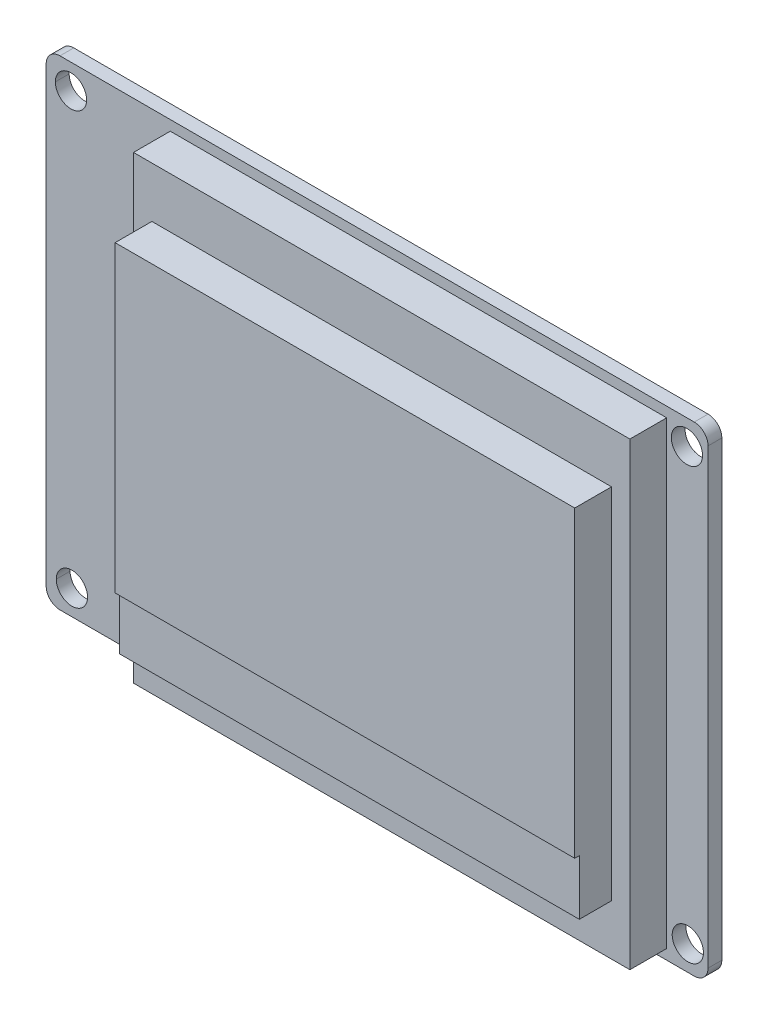
ISO-10303-21;
HEADER;
FILE_DESCRIPTION(('STEP AP214'),'2;1');
FILE_NAME('part.step','',(''),(''),'','','');
FILE_SCHEMA(('AUTOMOTIVE_DESIGN { 1 0 10303 214 1 1 1 1 }'));
ENDSEC;
DATA;
#1=APPLICATION_CONTEXT('core data for automotive mechanical design processes');
#2=APPLICATION_PROTOCOL_DEFINITION('international standard','automotive_design',2000,#1);
#3=PRODUCT_CONTEXT('',#1,'mechanical');
#4=PRODUCT('Part','Part','',(#3));
#5=PRODUCT_RELATED_PRODUCT_CATEGORY('part','',(#4));
#6=PRODUCT_DEFINITION_FORMATION('','',#4);
#7=PRODUCT_DEFINITION_CONTEXT('part definition',#1,'design');
#8=PRODUCT_DEFINITION('design','',#6,#7);
#9=PRODUCT_DEFINITION_SHAPE('','',#8);
#10=(LENGTH_UNIT() NAMED_UNIT(*) SI_UNIT(.MILLI.,.METRE.));
#11=(NAMED_UNIT(*) PLANE_ANGLE_UNIT() SI_UNIT($,.RADIAN.));
#12=(NAMED_UNIT(*) SI_UNIT($,.STERADIAN.) SOLID_ANGLE_UNIT());
#13=UNCERTAINTY_MEASURE_WITH_UNIT(LENGTH_MEASURE(1.E-05),#10,'distance_accuracy_value','');
#14=(GEOMETRIC_REPRESENTATION_CONTEXT(3) GLOBAL_UNCERTAINTY_ASSIGNED_CONTEXT((#13)) GLOBAL_UNIT_ASSIGNED_CONTEXT((#10,
#11,#12)) REPRESENTATION_CONTEXT('',''));
#15=CARTESIAN_POINT('',(0.,0.,0.));
#16=DIRECTION('',(0.,0.,1.));
#17=DIRECTION('',(1.,0.,0.));
#18=AXIS2_PLACEMENT_3D('',#15,#16,#17);
#19=CARTESIAN_POINT('',(-38.1,-23.4,1.5));
#20=DIRECTION('',(0.,0.,-1.));
#21=DIRECTION('',(-1.,0.,0.));
#22=AXIS2_PLACEMENT_3D('',#19,#20,#21);
#23=CYLINDRICAL_SURFACE('',#22,1.7);
#24=CARTESIAN_POINT('',(-38.1,-23.4,1.5));
#25=DIRECTION('',(0.,0.,1.));
#26=DIRECTION('',(1.,0.,0.));
#27=AXIS2_PLACEMENT_3D('',#24,#25,#26);
#28=CIRCLE('',#27,1.7);
#29=CARTESIAN_POINT('',(-39.8,-23.4,1.5));
#30=VERTEX_POINT('',#29);
#31=CARTESIAN_POINT('',(-36.4,-23.4,1.5));
#32=VERTEX_POINT('',#31);
#33=EDGE_CURVE('E280',#30,#32,#28,.T.);
#34=ORIENTED_EDGE('',*,*,#33,.T.);
#35=DIRECTION('',(0.,0.,-1.));
#36=VECTOR('',#35,1.);
#37=CARTESIAN_POINT('',(-36.4,-23.4,1.5));
#38=LINE('',#37,#36);
#39=CARTESIAN_POINT('',(-36.4,-23.4,0.));
#40=VERTEX_POINT('',#39);
#41=EDGE_CURVE('E243',#32,#40,#38,.T.);
#42=ORIENTED_EDGE('',*,*,#41,.T.);
#43=CARTESIAN_POINT('',(-38.1,-23.4,0.));
#44=DIRECTION('',(0.,0.,1.));
#45=DIRECTION('',(1.,0.,0.));
#46=AXIS2_PLACEMENT_3D('',#43,#44,#45);
#47=CIRCLE('',#46,1.7);
#48=CARTESIAN_POINT('',(-39.8,-23.4,0.));
#49=VERTEX_POINT('',#48);
#50=EDGE_CURVE('E242',#49,#40,#47,.T.);
#51=ORIENTED_EDGE('',*,*,#50,.F.);
#52=DIRECTION('',(0.,0.,-1.));
#53=VECTOR('',#52,1.);
#54=CARTESIAN_POINT('',(-39.8,-23.4,1.5));
#55=LINE('',#54,#53);
#56=EDGE_CURVE('E228',#30,#49,#55,.T.);
#57=ORIENTED_EDGE('',*,*,#56,.F.);
#58=EDGE_LOOP('',(#34,#42,#51,#57));
#59=FACE_BOUND('',#58,.T.);
#60=ADVANCED_FACE('F48',(#59),#23,.F.);
#61=CARTESIAN_POINT('',(-38.2,23.4,1.5));
#62=DIRECTION('',(0.,0.,-1.));
#63=DIRECTION('',(-1.,0.,0.));
#64=AXIS2_PLACEMENT_3D('',#61,#62,#63);
#65=CYLINDRICAL_SURFACE('',#64,1.7);
#66=CARTESIAN_POINT('',(-38.2,23.4,1.5));
#67=DIRECTION('',(0.,0.,1.));
#68=DIRECTION('',(1.,0.,0.));
#69=AXIS2_PLACEMENT_3D('',#66,#67,#68);
#70=CIRCLE('',#69,1.7);
#71=CARTESIAN_POINT('',(-39.9,23.4,1.5));
#72=VERTEX_POINT('',#71);
#73=CARTESIAN_POINT('',(-36.5,23.4,1.5));
#74=VERTEX_POINT('',#73);
#75=EDGE_CURVE('E364',#72,#74,#70,.T.);
#76=ORIENTED_EDGE('',*,*,#75,.T.);
#77=DIRECTION('',(0.,0.,-1.));
#78=VECTOR('',#77,1.);
#79=CARTESIAN_POINT('',(-36.5,23.4,1.5));
#80=LINE('',#79,#78);
#81=CARTESIAN_POINT('',(-36.5,23.4,0.));
#82=VERTEX_POINT('',#81);
#83=EDGE_CURVE('E361',#74,#82,#80,.T.);
#84=ORIENTED_EDGE('',*,*,#83,.T.);
#85=CARTESIAN_POINT('',(-38.2,23.4,0.));
#86=DIRECTION('',(0.,0.,1.));
#87=DIRECTION('',(1.,0.,0.));
#88=AXIS2_PLACEMENT_3D('',#85,#86,#87);
#89=CIRCLE('',#88,1.7);
#90=CARTESIAN_POINT('',(-39.9,23.4,0.));
#91=VERTEX_POINT('',#90);
#92=EDGE_CURVE('E251',#91,#82,#89,.T.);
#93=ORIENTED_EDGE('',*,*,#92,.F.);
#94=DIRECTION('',(0.,0.,-1.));
#95=VECTOR('',#94,1.);
#96=CARTESIAN_POINT('',(-39.9,23.4,1.5));
#97=LINE('',#96,#95);
#98=EDGE_CURVE('E391',#72,#91,#97,.T.);
#99=ORIENTED_EDGE('',*,*,#98,.F.);
#100=EDGE_LOOP('',(#76,#84,#93,#99));
#101=FACE_BOUND('',#100,.T.);
#102=ADVANCED_FACE('F515',(#101),#65,.F.);
#103=CARTESIAN_POINT('',(0.,0.,1.5));
#104=DIRECTION('',(0.,0.,1.));
#105=DIRECTION('',(1.,0.,0.));
#106=AXIS2_PLACEMENT_3D('',#103,#104,#105);
#107=PLANE('',#106);
#108=DIRECTION('',(1.,0.,0.));
#109=VECTOR('',#108,1.);
#110=CARTESIAN_POINT('',(50.5,-26.1,1.5));
#111=LINE('',#110,#109);
#112=CARTESIAN_POINT('',(-39.4,-26.1,1.5));
#113=VERTEX_POINT('',#112);
#114=CARTESIAN_POINT('',(29.6,-26.1,1.5));
#115=VERTEX_POINT('',#114);
#116=EDGE_CURVE('E337',#113,#115,#111,.T.);
#117=ORIENTED_EDGE('',*,*,#116,.T.);
#118=CARTESIAN_POINT('',(29.6,-24.6,1.5));
#119=DIRECTION('',(0.,0.,1.));
#120=DIRECTION('',(1.,0.,0.));
#121=AXIS2_PLACEMENT_3D('',#118,#119,#120);
#122=CIRCLE('',#121,1.5);
#123=CARTESIAN_POINT('',(31.1,-24.6,1.5));
#124=VERTEX_POINT('',#123);
#125=EDGE_CURVE('E309',#115,#124,#122,.T.);
#126=ORIENTED_EDGE('',*,*,#125,.T.);
#127=DIRECTION('',(0.,-1.,0.));
#128=VECTOR('',#127,1.);
#129=CARTESIAN_POINT('',(31.1,0.,1.5));
#130=LINE('',#129,#128);
#131=CARTESIAN_POINT('',(31.1,24.6,1.5));
#132=VERTEX_POINT('',#131);
#133=EDGE_CURVE('E336',#132,#124,#130,.T.);
#134=ORIENTED_EDGE('',*,*,#133,.F.);
#135=CARTESIAN_POINT('',(29.6,24.6,1.5));
#136=DIRECTION('',(0.,0.,1.));
#137=DIRECTION('',(1.,0.,0.));
#138=AXIS2_PLACEMENT_3D('',#135,#136,#137);
#139=CIRCLE('',#138,1.5);
#140=CARTESIAN_POINT('',(29.6,26.1,1.5));
#141=VERTEX_POINT('',#140);
#142=EDGE_CURVE('E307',#132,#141,#139,.T.);
#143=ORIENTED_EDGE('',*,*,#142,.T.);
#144=DIRECTION('',(-1.,0.,0.));
#145=VECTOR('',#144,1.);
#146=CARTESIAN_POINT('',(50.5,26.1,1.5));
#147=LINE('',#146,#145);
#148=CARTESIAN_POINT('',(-39.4,26.1,1.5));
#149=VERTEX_POINT('',#148);
#150=EDGE_CURVE('E246',#141,#149,#147,.T.);
#151=ORIENTED_EDGE('',*,*,#150,.T.);
#152=CARTESIAN_POINT('',(-39.4,24.6,1.5));
#153=DIRECTION('',(0.,0.,1.));
#154=DIRECTION('',(1.,0.,0.));
#155=AXIS2_PLACEMENT_3D('',#152,#153,#154);
#156=CIRCLE('',#155,1.5);
#157=CARTESIAN_POINT('',(-40.9,24.6,1.5));
#158=VERTEX_POINT('',#157);
#159=EDGE_CURVE('E282',#149,#158,#156,.T.);
#160=ORIENTED_EDGE('',*,*,#159,.T.);
#161=DIRECTION('',(0.,1.,0.));
#162=VECTOR('',#161,1.);
#163=CARTESIAN_POINT('',(-40.9,0.,1.5));
#164=LINE('',#163,#162);
#165=CARTESIAN_POINT('',(-40.9,-24.6,1.5));
#166=VERTEX_POINT('',#165);
#167=EDGE_CURVE('E350',#166,#158,#164,.T.);
#168=ORIENTED_EDGE('',*,*,#167,.F.);
#169=CARTESIAN_POINT('',(-39.4,-24.6,1.5));
#170=DIRECTION('',(0.,0.,1.));
#171=DIRECTION('',(1.,0.,0.));
#172=AXIS2_PLACEMENT_3D('',#169,#170,#171);
#173=CIRCLE('',#172,1.5);
#174=EDGE_CURVE('E279',#166,#113,#173,.T.);
#175=ORIENTED_EDGE('',*,*,#174,.T.);
#176=EDGE_LOOP('',(#117,#126,#134,#143,#151,#160,#168,#175));
#177=FACE_BOUND('',#176,.T.);
#178=CARTESIAN_POINT('',(28.8,23.4,1.5));
#179=DIRECTION('',(0.,0.,1.));
#180=DIRECTION('',(1.,0.,0.));
#181=AXIS2_PLACEMENT_3D('',#178,#179,#180);
#182=CIRCLE('',#181,1.7);
#183=CARTESIAN_POINT('',(30.5,23.4,1.5));
#184=VERTEX_POINT('',#183);
#185=EDGE_CURVE('E301',#184,#184,#182,.T.);
#186=ORIENTED_EDGE('',*,*,#185,.F.);
#187=EDGE_LOOP('',(#186));
#188=FACE_BOUND('',#187,.T.);
#189=CARTESIAN_POINT('',(28.9,-23.4,1.5));
#190=DIRECTION('',(0.,0.,1.));
#191=DIRECTION('',(1.,0.,0.));
#192=AXIS2_PLACEMENT_3D('',#189,#190,#191);
#193=CIRCLE('',#192,1.7);
#194=CARTESIAN_POINT('',(30.6,-23.4,1.5));
#195=VERTEX_POINT('',#194);
#196=EDGE_CURVE('E340',#195,#195,#193,.T.);
#197=ORIENTED_EDGE('',*,*,#196,.F.);
#198=EDGE_LOOP('',(#197));
#199=FACE_BOUND('',#198,.T.);
#200=ORIENTED_EDGE('',*,*,#75,.F.);
#201=CARTESIAN_POINT('',(-38.2,23.4,1.5));
#202=DIRECTION('',(0.,0.,1.));
#203=DIRECTION('',(1.,0.,0.));
#204=AXIS2_PLACEMENT_3D('',#201,#202,#203);
#205=CIRCLE('',#204,1.7);
#206=EDGE_CURVE('E440',#74,#72,#205,.T.);
#207=ORIENTED_EDGE('',*,*,#206,.F.);
#208=EDGE_LOOP('',(#200,#207));
#209=FACE_BOUND('',#208,.T.);
#210=ORIENTED_EDGE('',*,*,#33,.F.);
#211=CARTESIAN_POINT('',(-38.1,-23.4,1.5));
#212=DIRECTION('',(0.,0.,1.));
#213=DIRECTION('',(1.,0.,0.));
#214=AXIS2_PLACEMENT_3D('',#211,#212,#213);
#215=CIRCLE('',#214,1.7);
#216=EDGE_CURVE('E234',#32,#30,#215,.T.);
#217=ORIENTED_EDGE('',*,*,#216,.F.);
#218=EDGE_LOOP('',(#210,#217));
#219=FACE_BOUND('',#218,.T.);
#220=DIRECTION('',(1.,0.,0.));
#221=VECTOR('',#220,1.);
#222=CARTESIAN_POINT('',(-27.4,-25.,1.5));
#223=LINE('',#222,#221);
#224=CARTESIAN_POINT('',(-27.4,-25.,1.5));
#225=VERTEX_POINT('',#224);
#226=CARTESIAN_POINT('',(26.6,-25.,1.5));
#227=VERTEX_POINT('',#226);
#228=EDGE_CURVE('E380',#225,#227,#223,.T.);
#229=ORIENTED_EDGE('',*,*,#228,.F.);
#230=DIRECTION('',(0.,-1.,0.));
#231=VECTOR('',#230,1.);
#232=CARTESIAN_POINT('',(-27.4,25.,1.5));
#233=LINE('',#232,#231);
#234=CARTESIAN_POINT('',(-27.4,25.,1.5));
#235=VERTEX_POINT('',#234);
#236=EDGE_CURVE('E239',#235,#225,#233,.T.);
#237=ORIENTED_EDGE('',*,*,#236,.F.);
#238=DIRECTION('',(-1.,0.,0.));
#239=VECTOR('',#238,1.);
#240=CARTESIAN_POINT('',(-27.4,25.,1.5));
#241=LINE('',#240,#239);
#242=CARTESIAN_POINT('',(26.6,25.,1.5));
#243=VERTEX_POINT('',#242);
#244=EDGE_CURVE('E379',#243,#235,#241,.T.);
#245=ORIENTED_EDGE('',*,*,#244,.F.);
#246=DIRECTION('',(0.,1.,0.));
#247=VECTOR('',#246,1.);
#248=CARTESIAN_POINT('',(26.6,25.,1.5));
#249=LINE('',#248,#247);
#250=EDGE_CURVE('E402',#227,#243,#249,.T.);
#251=ORIENTED_EDGE('',*,*,#250,.F.);
#252=EDGE_LOOP('',(#229,#237,#245,#251));
#253=FACE_BOUND('',#252,.T.);
#254=ADVANCED_FACE('F334',(#177,#188,#199,#209,#219,#253),#107,.T.);
#255=CARTESIAN_POINT('',(0.,0.,0.));
#256=DIRECTION('',(0.,0.,1.));
#257=DIRECTION('',(1.,0.,0.));
#258=AXIS2_PLACEMENT_3D('',#255,#256,#257);
#259=PLANE('',#258);
#260=CARTESIAN_POINT('',(28.8,23.4,0.));
#261=DIRECTION('',(0.,0.,1.));
#262=DIRECTION('',(1.,0.,0.));
#263=AXIS2_PLACEMENT_3D('',#260,#261,#262);
#264=CIRCLE('',#263,1.7);
#265=CARTESIAN_POINT('',(30.5,23.4,0.));
#266=VERTEX_POINT('',#265);
#267=EDGE_CURVE('E300',#266,#266,#264,.T.);
#268=ORIENTED_EDGE('',*,*,#267,.T.);
#269=EDGE_LOOP('',(#268));
#270=FACE_BOUND('',#269,.T.);
#271=CARTESIAN_POINT('',(28.9,-23.4,0.));
#272=DIRECTION('',(0.,0.,1.));
#273=DIRECTION('',(1.,0.,0.));
#274=AXIS2_PLACEMENT_3D('',#271,#272,#273);
#275=CIRCLE('',#274,1.7);
#276=CARTESIAN_POINT('',(30.6,-23.4,0.));
#277=VERTEX_POINT('',#276);
#278=EDGE_CURVE('E297',#277,#277,#275,.T.);
#279=ORIENTED_EDGE('',*,*,#278,.T.);
#280=EDGE_LOOP('',(#279));
#281=FACE_BOUND('',#280,.T.);
#282=DIRECTION('',(0.,-1.,0.));
#283=VECTOR('',#282,1.);
#284=CARTESIAN_POINT('',(31.1,26.1,0.));
#285=LINE('',#284,#283);
#286=CARTESIAN_POINT('',(31.1,24.6,0.));
#287=VERTEX_POINT('',#286);
#288=CARTESIAN_POINT('',(31.1,-24.6,0.));
#289=VERTEX_POINT('',#288);
#290=EDGE_CURVE('E321',#287,#289,#285,.T.);
#291=ORIENTED_EDGE('',*,*,#290,.T.);
#292=CARTESIAN_POINT('',(29.6,-24.6,0.));
#293=DIRECTION('',(0.,0.,1.));
#294=DIRECTION('',(1.,0.,0.));
#295=AXIS2_PLACEMENT_3D('',#292,#293,#294);
#296=CIRCLE('',#295,1.5);
#297=CARTESIAN_POINT('',(29.6,-26.1,0.));
#298=VERTEX_POINT('',#297);
#299=EDGE_CURVE('E56',#289,#298,#296,.F.);
#300=ORIENTED_EDGE('',*,*,#299,.T.);
#301=DIRECTION('',(1.,0.,0.));
#302=VECTOR('',#301,1.);
#303=CARTESIAN_POINT('',(50.5,-26.1,0.));
#304=LINE('',#303,#302);
#305=CARTESIAN_POINT('',(-39.4,-26.1,0.));
#306=VERTEX_POINT('',#305);
#307=EDGE_CURVE('E320',#306,#298,#304,.T.);
#308=ORIENTED_EDGE('',*,*,#307,.F.);
#309=CARTESIAN_POINT('',(-39.4,-24.6,0.));
#310=DIRECTION('',(0.,0.,1.));
#311=DIRECTION('',(1.,0.,0.));
#312=AXIS2_PLACEMENT_3D('',#309,#310,#311);
#313=CIRCLE('',#312,1.5);
#314=CARTESIAN_POINT('',(-40.9,-24.6,0.));
#315=VERTEX_POINT('',#314);
#316=EDGE_CURVE('E288',#306,#315,#313,.F.);
#317=ORIENTED_EDGE('',*,*,#316,.T.);
#318=DIRECTION('',(0.,1.,0.));
#319=VECTOR('',#318,1.);
#320=CARTESIAN_POINT('',(-40.9,0.,0.));
#321=LINE('',#320,#319);
#322=CARTESIAN_POINT('',(-40.9,24.6,0.));
#323=VERTEX_POINT('',#322);
#324=EDGE_CURVE('E304',#315,#323,#321,.T.);
#325=ORIENTED_EDGE('',*,*,#324,.T.);
#326=CARTESIAN_POINT('',(-39.4,24.6,0.));
#327=DIRECTION('',(0.,0.,1.));
#328=DIRECTION('',(1.,0.,0.));
#329=AXIS2_PLACEMENT_3D('',#326,#327,#328);
#330=CIRCLE('',#329,1.5);
#331=CARTESIAN_POINT('',(-39.4,26.1,0.));
#332=VERTEX_POINT('',#331);
#333=EDGE_CURVE('E290',#323,#332,#330,.F.);
#334=ORIENTED_EDGE('',*,*,#333,.T.);
#335=DIRECTION('',(-1.,0.,0.));
#336=VECTOR('',#335,1.);
#337=CARTESIAN_POINT('',(50.5,26.1,0.));
#338=LINE('',#337,#336);
#339=CARTESIAN_POINT('',(29.6,26.1,0.));
#340=VERTEX_POINT('',#339);
#341=EDGE_CURVE('E329',#340,#332,#338,.T.);
#342=ORIENTED_EDGE('',*,*,#341,.F.);
#343=CARTESIAN_POINT('',(29.6,24.6,0.));
#344=DIRECTION('',(0.,0.,1.));
#345=DIRECTION('',(1.,0.,0.));
#346=AXIS2_PLACEMENT_3D('',#343,#344,#345);
#347=CIRCLE('',#346,1.5);
#348=EDGE_CURVE('E315',#340,#287,#347,.F.);
#349=ORIENTED_EDGE('',*,*,#348,.T.);
#350=EDGE_LOOP('',(#291,#300,#308,#317,#325,#334,#342,#349));
#351=FACE_BOUND('',#350,.T.);
#352=ORIENTED_EDGE('',*,*,#50,.T.);
#353=CARTESIAN_POINT('',(-38.1,-23.4,0.));
#354=DIRECTION('',(0.,0.,1.));
#355=DIRECTION('',(1.,0.,0.));
#356=AXIS2_PLACEMENT_3D('',#353,#354,#355);
#357=CIRCLE('',#356,1.7);
#358=EDGE_CURVE('E232',#40,#49,#357,.T.);
#359=ORIENTED_EDGE('',*,*,#358,.T.);
#360=EDGE_LOOP('',(#352,#359));
#361=FACE_BOUND('',#360,.T.);
#362=ORIENTED_EDGE('',*,*,#92,.T.);
#363=CARTESIAN_POINT('',(-38.2,23.4,0.));
#364=DIRECTION('',(0.,0.,1.));
#365=DIRECTION('',(1.,0.,0.));
#366=AXIS2_PLACEMENT_3D('',#363,#364,#365);
#367=CIRCLE('',#366,1.7);
#368=EDGE_CURVE('E257',#82,#91,#367,.T.);
#369=ORIENTED_EDGE('',*,*,#368,.T.);
#370=EDGE_LOOP('',(#362,#369));
#371=FACE_BOUND('',#370,.T.);
#372=ADVANCED_FACE('F248',(#270,#281,#351,#361,#371),#259,.F.);
#373=CARTESIAN_POINT('',(50.5,-26.1,1.5));
#374=DIRECTION('',(0.,1.,0.));
#375=DIRECTION('',(1.,0.,0.));
#376=AXIS2_PLACEMENT_3D('',#373,#374,#375);
#377=PLANE('',#376);
#378=ORIENTED_EDGE('',*,*,#307,.T.);
#379=DIRECTION('',(0.,0.,1.));
#380=VECTOR('',#379,1.);
#381=CARTESIAN_POINT('',(29.6,-26.1,1.5));
#382=LINE('',#381,#380);
#383=EDGE_CURVE('E296',#298,#115,#382,.T.);
#384=ORIENTED_EDGE('',*,*,#383,.T.);
#385=ORIENTED_EDGE('',*,*,#116,.F.);
#386=DIRECTION('',(0.,0.,-1.));
#387=VECTOR('',#386,1.);
#388=CARTESIAN_POINT('',(-39.4,-26.1,1.5));
#389=LINE('',#388,#387);
#390=EDGE_CURVE('E293',#113,#306,#389,.T.);
#391=ORIENTED_EDGE('',*,*,#390,.T.);
#392=EDGE_LOOP('',(#378,#384,#385,#391));
#393=FACE_BOUND('',#392,.T.);
#394=ADVANCED_FACE('F325',(#393),#377,.F.);
#395=CARTESIAN_POINT('',(50.5,26.1,1.5));
#396=DIRECTION('',(0.,-1.,0.));
#397=DIRECTION('',(0.,0.,-1.));
#398=AXIS2_PLACEMENT_3D('',#395,#396,#397);
#399=PLANE('',#398);
#400=ORIENTED_EDGE('',*,*,#150,.F.);
#401=DIRECTION('',(0.,0.,1.));
#402=VECTOR('',#401,1.);
#403=CARTESIAN_POINT('',(29.6,26.1,1.5));
#404=LINE('',#403,#402);
#405=EDGE_CURVE('E11',#141,#340,#404,.F.);
#406=ORIENTED_EDGE('',*,*,#405,.T.);
#407=ORIENTED_EDGE('',*,*,#341,.T.);
#408=DIRECTION('',(0.,0.,1.));
#409=VECTOR('',#408,1.);
#410=CARTESIAN_POINT('',(-39.4,26.1,1.5));
#411=LINE('',#410,#409);
#412=EDGE_CURVE('E276',#332,#149,#411,.T.);
#413=ORIENTED_EDGE('',*,*,#412,.T.);
#414=EDGE_LOOP('',(#400,#406,#407,#413));
#415=FACE_BOUND('',#414,.T.);
#416=ADVANCED_FACE('F531',(#415),#399,.F.);
#417=CARTESIAN_POINT('',(-38.2,23.4,1.5));
#418=DIRECTION('',(0.,0.,-1.));
#419=DIRECTION('',(-1.,0.,0.));
#420=AXIS2_PLACEMENT_3D('',#417,#418,#419);
#421=CYLINDRICAL_SURFACE('',#420,1.7);
#422=ORIENTED_EDGE('',*,*,#83,.F.);
#423=ORIENTED_EDGE('',*,*,#206,.T.);
#424=ORIENTED_EDGE('',*,*,#98,.T.);
#425=ORIENTED_EDGE('',*,*,#368,.F.);
#426=EDGE_LOOP('',(#422,#423,#424,#425));
#427=FACE_BOUND('',#426,.T.);
#428=ADVANCED_FACE('F528',(#427),#421,.F.);
#429=CARTESIAN_POINT('',(-38.1,-23.4,1.5));
#430=DIRECTION('',(0.,0.,-1.));
#431=DIRECTION('',(-1.,0.,0.));
#432=AXIS2_PLACEMENT_3D('',#429,#430,#431);
#433=CYLINDRICAL_SURFACE('',#432,1.7);
#434=ORIENTED_EDGE('',*,*,#41,.F.);
#435=ORIENTED_EDGE('',*,*,#216,.T.);
#436=ORIENTED_EDGE('',*,*,#56,.T.);
#437=ORIENTED_EDGE('',*,*,#358,.F.);
#438=EDGE_LOOP('',(#434,#435,#436,#437));
#439=FACE_BOUND('',#438,.T.);
#440=ADVANCED_FACE('F230',(#439),#433,.F.);
#441=CARTESIAN_POINT('',(-27.4,25.,5.5));
#442=DIRECTION('',(1.,0.,0.));
#443=DIRECTION('',(0.,1.,0.));
#444=AXIS2_PLACEMENT_3D('',#441,#442,#443);
#445=PLANE('',#444);
#446=ORIENTED_EDGE('',*,*,#236,.T.);
#447=DIRECTION('',(0.,0.,-1.));
#448=VECTOR('',#447,1.);
#449=CARTESIAN_POINT('',(-27.4,-25.,5.5));
#450=LINE('',#449,#448);
#451=CARTESIAN_POINT('',(-27.4,-25.,5.5));
#452=VERTEX_POINT('',#451);
#453=EDGE_CURVE('E385',#452,#225,#450,.T.);
#454=ORIENTED_EDGE('',*,*,#453,.F.);
#455=DIRECTION('',(0.,-1.,0.));
#456=VECTOR('',#455,1.);
#457=CARTESIAN_POINT('',(-27.4,25.,5.5));
#458=LINE('',#457,#456);
#459=CARTESIAN_POINT('',(-27.4,25.,5.5));
#460=VERTEX_POINT('',#459);
#461=EDGE_CURVE('E263',#460,#452,#458,.T.);
#462=ORIENTED_EDGE('',*,*,#461,.F.);
#463=DIRECTION('',(0.,0.,-1.));
#464=VECTOR('',#463,1.);
#465=CARTESIAN_POINT('',(-27.4,25.,5.5));
#466=LINE('',#465,#464);
#467=EDGE_CURVE('E384',#460,#235,#466,.T.);
#468=ORIENTED_EDGE('',*,*,#467,.T.);
#469=EDGE_LOOP('',(#446,#454,#462,#468));
#470=FACE_BOUND('',#469,.T.);
#471=ADVANCED_FACE('F527',(#470),#445,.F.);
#472=CARTESIAN_POINT('',(-27.4,-25.,5.5));
#473=DIRECTION('',(0.,1.,0.));
#474=DIRECTION('',(1.,0.,0.));
#475=AXIS2_PLACEMENT_3D('',#472,#473,#474);
#476=PLANE('',#475);
#477=ORIENTED_EDGE('',*,*,#228,.T.);
#478=DIRECTION('',(0.,0.,-1.));
#479=VECTOR('',#478,1.);
#480=CARTESIAN_POINT('',(26.6,-25.,5.5));
#481=LINE('',#480,#479);
#482=CARTESIAN_POINT('',(26.6,-25.,5.5));
#483=VERTEX_POINT('',#482);
#484=EDGE_CURVE('E406',#483,#227,#481,.T.);
#485=ORIENTED_EDGE('',*,*,#484,.F.);
#486=DIRECTION('',(1.,0.,0.));
#487=VECTOR('',#486,1.);
#488=CARTESIAN_POINT('',(-27.4,-25.,5.5));
#489=LINE('',#488,#487);
#490=EDGE_CURVE('E266',#452,#483,#489,.T.);
#491=ORIENTED_EDGE('',*,*,#490,.F.);
#492=ORIENTED_EDGE('',*,*,#453,.T.);
#493=EDGE_LOOP('',(#477,#485,#491,#492));
#494=FACE_BOUND('',#493,.T.);
#495=ADVANCED_FACE('F533',(#494),#476,.F.);
#496=CARTESIAN_POINT('',(26.6,25.,5.5));
#497=DIRECTION('',(-1.,0.,0.));
#498=DIRECTION('',(0.,1.,0.));
#499=AXIS2_PLACEMENT_3D('',#496,#497,#498);
#500=PLANE('',#499);
#501=ORIENTED_EDGE('',*,*,#250,.T.);
#502=DIRECTION('',(0.,0.,-1.));
#503=VECTOR('',#502,1.);
#504=CARTESIAN_POINT('',(26.6,25.,5.5));
#505=LINE('',#504,#503);
#506=CARTESIAN_POINT('',(26.6,25.,5.5));
#507=VERTEX_POINT('',#506);
#508=EDGE_CURVE('E265',#507,#243,#505,.T.);
#509=ORIENTED_EDGE('',*,*,#508,.F.);
#510=DIRECTION('',(0.,1.,0.));
#511=VECTOR('',#510,1.);
#512=CARTESIAN_POINT('',(26.6,25.,5.5));
#513=LINE('',#512,#511);
#514=EDGE_CURVE('E269',#483,#507,#513,.T.);
#515=ORIENTED_EDGE('',*,*,#514,.F.);
#516=ORIENTED_EDGE('',*,*,#484,.T.);
#517=EDGE_LOOP('',(#501,#509,#515,#516));
#518=FACE_BOUND('',#517,.T.);
#519=ADVANCED_FACE('F509',(#518),#500,.F.);
#520=CARTESIAN_POINT('',(-27.4,25.,5.5));
#521=DIRECTION('',(0.,-1.,0.));
#522=DIRECTION('',(0.,0.,-1.));
#523=AXIS2_PLACEMENT_3D('',#520,#521,#522);
#524=PLANE('',#523);
#525=ORIENTED_EDGE('',*,*,#244,.T.);
#526=ORIENTED_EDGE('',*,*,#467,.F.);
#527=DIRECTION('',(-1.,0.,0.));
#528=VECTOR('',#527,1.);
#529=CARTESIAN_POINT('',(-27.4,25.,5.5));
#530=LINE('',#529,#528);
#531=EDGE_CURVE('E397',#507,#460,#530,.T.);
#532=ORIENTED_EDGE('',*,*,#531,.F.);
#533=ORIENTED_EDGE('',*,*,#508,.T.);
#534=EDGE_LOOP('',(#525,#526,#532,#533));
#535=FACE_BOUND('',#534,.T.);
#536=ADVANCED_FACE('F501',(#535),#524,.F.);
#537=CARTESIAN_POINT('',(0.,0.,5.5));
#538=DIRECTION('',(0.,0.,1.));
#539=DIRECTION('',(1.,0.,0.));
#540=AXIS2_PLACEMENT_3D('',#537,#538,#539);
#541=PLANE('',#540);
#542=ORIENTED_EDGE('',*,*,#461,.T.);
#543=ORIENTED_EDGE('',*,*,#490,.T.);
#544=ORIENTED_EDGE('',*,*,#514,.T.);
#545=ORIENTED_EDGE('',*,*,#531,.T.);
#546=EDGE_LOOP('',(#542,#543,#544,#545));
#547=FACE_BOUND('',#546,.T.);
#548=DIRECTION('',(0.,-1.,0.));
#549=VECTOR('',#548,1.);
#550=CARTESIAN_POINT('',(-25.4,19.5,5.5));
#551=LINE('',#550,#549);
#552=CARTESIAN_POINT('',(-25.4,19.5,5.5));
#553=VERTEX_POINT('',#552);
#554=CARTESIAN_POINT('',(-25.4,-19.5,5.5));
#555=VERTEX_POINT('',#554);
#556=EDGE_CURVE('E270',#553,#555,#551,.T.);
#557=ORIENTED_EDGE('',*,*,#556,.F.);
#558=DIRECTION('',(-1.,0.,0.));
#559=VECTOR('',#558,1.);
#560=CARTESIAN_POINT('',(-25.4,19.5,5.5));
#561=LINE('',#560,#559);
#562=CARTESIAN_POINT('',(24.6,19.5,5.5));
#563=VERTEX_POINT('',#562);
#564=EDGE_CURVE('E371',#563,#553,#561,.T.);
#565=ORIENTED_EDGE('',*,*,#564,.F.);
#566=DIRECTION('',(0.,1.,0.));
#567=VECTOR('',#566,1.);
#568=CARTESIAN_POINT('',(24.6,19.5,5.5));
#569=LINE('',#568,#567);
#570=CARTESIAN_POINT('',(24.6,-19.5,5.5));
#571=VERTEX_POINT('',#570);
#572=EDGE_CURVE('E366',#571,#563,#569,.T.);
#573=ORIENTED_EDGE('',*,*,#572,.F.);
#574=DIRECTION('',(1.,0.,0.));
#575=VECTOR('',#574,1.);
#576=CARTESIAN_POINT('',(-25.4,-19.5,5.5));
#577=LINE('',#576,#575);
#578=EDGE_CURVE('E375',#555,#571,#577,.T.);
#579=ORIENTED_EDGE('',*,*,#578,.F.);
#580=EDGE_LOOP('',(#557,#565,#573,#579));
#581=FACE_BOUND('',#580,.T.);
#582=ADVANCED_FACE('F499',(#547,#581),#541,.T.);
#583=CARTESIAN_POINT('',(-25.4,19.5,9.5));
#584=DIRECTION('',(1.,0.,0.));
#585=DIRECTION('',(0.,1.,0.));
#586=AXIS2_PLACEMENT_3D('',#583,#584,#585);
#587=PLANE('',#586);
#588=DIRECTION('',(0.,-1.,0.));
#589=VECTOR('',#588,1.);
#590=CARTESIAN_POINT('',(-25.4,-19.5,9.));
#591=LINE('',#590,#589);
#592=CARTESIAN_POINT('',(-25.4,-13.5,9.));
#593=VERTEX_POINT('',#592);
#594=CARTESIAN_POINT('',(-25.4,-19.5,9.));
#595=VERTEX_POINT('',#594);
#596=EDGE_CURVE('E261',#593,#595,#591,.T.);
#597=ORIENTED_EDGE('',*,*,#596,.F.);
#598=DIRECTION('',(0.,0.,1.));
#599=VECTOR('',#598,1.);
#600=CARTESIAN_POINT('',(-25.4,-13.5,9.));
#601=LINE('',#600,#599);
#602=CARTESIAN_POINT('',(-25.4,-13.5,9.5));
#603=VERTEX_POINT('',#602);
#604=EDGE_CURVE('E414',#593,#603,#601,.T.);
#605=ORIENTED_EDGE('',*,*,#604,.T.);
#606=DIRECTION('',(0.,-1.,0.));
#607=VECTOR('',#606,1.);
#608=CARTESIAN_POINT('',(-25.4,19.5,9.5));
#609=LINE('',#608,#607);
#610=CARTESIAN_POINT('',(-25.4,19.5,9.5));
#611=VERTEX_POINT('',#610);
#612=EDGE_CURVE('E426',#611,#603,#609,.T.);
#613=ORIENTED_EDGE('',*,*,#612,.F.);
#614=DIRECTION('',(0.,0.,-1.));
#615=VECTOR('',#614,1.);
#616=CARTESIAN_POINT('',(-25.4,19.5,9.5));
#617=LINE('',#616,#615);
#618=EDGE_CURVE('E274',#611,#553,#617,.T.);
#619=ORIENTED_EDGE('',*,*,#618,.T.);
#620=ORIENTED_EDGE('',*,*,#556,.T.);
#621=DIRECTION('',(0.,0.,-1.));
#622=VECTOR('',#621,1.);
#623=CARTESIAN_POINT('',(-25.4,-19.5,9.5));
#624=LINE('',#623,#622);
#625=EDGE_CURVE('E275',#595,#555,#624,.T.);
#626=ORIENTED_EDGE('',*,*,#625,.F.);
#627=EDGE_LOOP('',(#597,#605,#613,#619,#620,#626));
#628=FACE_BOUND('',#627,.T.);
#629=ADVANCED_FACE('F479',(#628),#587,.F.);
#630=CARTESIAN_POINT('',(-25.4,-19.5,9.5));
#631=DIRECTION('',(0.,1.,0.));
#632=DIRECTION('',(1.,0.,0.));
#633=AXIS2_PLACEMENT_3D('',#630,#631,#632);
#634=PLANE('',#633);
#635=DIRECTION('',(0.,0.,-1.));
#636=VECTOR('',#635,1.);
#637=CARTESIAN_POINT('',(24.6,-19.5,9.5));
#638=LINE('',#637,#636);
#639=CARTESIAN_POINT('',(24.6,-19.5,9.));
#640=VERTEX_POINT('',#639);
#641=EDGE_CURVE('E370',#640,#571,#638,.T.);
#642=ORIENTED_EDGE('',*,*,#641,.F.);
#643=DIRECTION('',(1.,0.,0.));
#644=VECTOR('',#643,1.);
#645=CARTESIAN_POINT('',(-25.4,-19.5,9.));
#646=LINE('',#645,#644);
#647=EDGE_CURVE('E437',#595,#640,#646,.T.);
#648=ORIENTED_EDGE('',*,*,#647,.F.);
#649=ORIENTED_EDGE('',*,*,#625,.T.);
#650=ORIENTED_EDGE('',*,*,#578,.T.);
#651=EDGE_LOOP('',(#642,#648,#649,#650));
#652=FACE_BOUND('',#651,.T.);
#653=ADVANCED_FACE('F482',(#652),#634,.F.);
#654=CARTESIAN_POINT('',(24.6,19.5,9.5));
#655=DIRECTION('',(-1.,0.,0.));
#656=DIRECTION('',(0.,1.,0.));
#657=AXIS2_PLACEMENT_3D('',#654,#655,#656);
#658=PLANE('',#657);
#659=DIRECTION('',(0.,1.,0.));
#660=VECTOR('',#659,1.);
#661=CARTESIAN_POINT('',(24.6,19.5,9.5));
#662=LINE('',#661,#660);
#663=CARTESIAN_POINT('',(24.6,-13.5,9.5));
#664=VERTEX_POINT('',#663);
#665=CARTESIAN_POINT('',(24.6,19.5,9.5));
#666=VERTEX_POINT('',#665);
#667=EDGE_CURVE('E398',#664,#666,#662,.T.);
#668=ORIENTED_EDGE('',*,*,#667,.F.);
#669=DIRECTION('',(0.,0.,1.));
#670=VECTOR('',#669,1.);
#671=CARTESIAN_POINT('',(24.6,-13.5,9.));
#672=LINE('',#671,#670);
#673=CARTESIAN_POINT('',(24.6,-13.5,9.));
#674=VERTEX_POINT('',#673);
#675=EDGE_CURVE('E417',#674,#664,#672,.T.);
#676=ORIENTED_EDGE('',*,*,#675,.F.);
#677=DIRECTION('',(0.,1.,0.));
#678=VECTOR('',#677,1.);
#679=CARTESIAN_POINT('',(24.6,-19.5,9.));
#680=LINE('',#679,#678);
#681=EDGE_CURVE('E360',#640,#674,#680,.T.);
#682=ORIENTED_EDGE('',*,*,#681,.F.);
#683=ORIENTED_EDGE('',*,*,#641,.T.);
#684=ORIENTED_EDGE('',*,*,#572,.T.);
#685=DIRECTION('',(0.,0.,-1.));
#686=VECTOR('',#685,1.);
#687=CARTESIAN_POINT('',(24.6,19.5,9.5));
#688=LINE('',#687,#686);
#689=EDGE_CURVE('E388',#666,#563,#688,.T.);
#690=ORIENTED_EDGE('',*,*,#689,.F.);
#691=EDGE_LOOP('',(#668,#676,#682,#683,#684,#690));
#692=FACE_BOUND('',#691,.T.);
#693=ADVANCED_FACE('F487',(#692),#658,.F.);
#694=CARTESIAN_POINT('',(-25.4,19.5,9.5));
#695=DIRECTION('',(0.,-1.,0.));
#696=DIRECTION('',(0.,0.,-1.));
#697=AXIS2_PLACEMENT_3D('',#694,#695,#696);
#698=PLANE('',#697);
#699=ORIENTED_EDGE('',*,*,#564,.T.);
#700=ORIENTED_EDGE('',*,*,#618,.F.);
#701=DIRECTION('',(-1.,0.,0.));
#702=VECTOR('',#701,1.);
#703=CARTESIAN_POINT('',(-25.4,19.5,9.5));
#704=LINE('',#703,#702);
#705=EDGE_CURVE('E400',#666,#611,#704,.T.);
#706=ORIENTED_EDGE('',*,*,#705,.F.);
#707=ORIENTED_EDGE('',*,*,#689,.T.);
#708=EDGE_LOOP('',(#699,#700,#706,#707));
#709=FACE_BOUND('',#708,.T.);
#710=ADVANCED_FACE('F496',(#709),#698,.F.);
#711=CARTESIAN_POINT('',(0.,0.,9.5));
#712=DIRECTION('',(0.,0.,1.));
#713=DIRECTION('',(1.,0.,0.));
#714=AXIS2_PLACEMENT_3D('',#711,#712,#713);
#715=PLANE('',#714);
#716=DIRECTION('',(-1.,0.,0.));
#717=VECTOR('',#716,1.);
#718=CARTESIAN_POINT('',(-25.4,-13.5,9.5));
#719=LINE('',#718,#717);
#720=EDGE_CURVE('E420',#664,#603,#719,.T.);
#721=ORIENTED_EDGE('',*,*,#720,.F.);
#722=ORIENTED_EDGE('',*,*,#667,.T.);
#723=ORIENTED_EDGE('',*,*,#705,.T.);
#724=ORIENTED_EDGE('',*,*,#612,.T.);
#725=EDGE_LOOP('',(#721,#722,#723,#724));
#726=FACE_BOUND('',#725,.T.);
#727=ADVANCED_FACE('F497',(#726),#715,.T.);
#728=CARTESIAN_POINT('',(-25.4,-13.5,9.));
#729=DIRECTION('',(0.,1.,0.));
#730=DIRECTION('',(1.,0.,0.));
#731=AXIS2_PLACEMENT_3D('',#728,#729,#730);
#732=PLANE('',#731);
#733=ORIENTED_EDGE('',*,*,#720,.T.);
#734=ORIENTED_EDGE('',*,*,#604,.F.);
#735=DIRECTION('',(-1.,0.,0.));
#736=VECTOR('',#735,1.);
#737=CARTESIAN_POINT('',(-25.4,-13.5,9.));
#738=LINE('',#737,#736);
#739=EDGE_CURVE('E353',#674,#593,#738,.T.);
#740=ORIENTED_EDGE('',*,*,#739,.F.);
#741=ORIENTED_EDGE('',*,*,#675,.T.);
#742=EDGE_LOOP('',(#733,#734,#740,#741));
#743=FACE_BOUND('',#742,.T.);
#744=ADVANCED_FACE('F491',(#743),#732,.F.);
#745=CARTESIAN_POINT('',(0.,0.,9.));
#746=DIRECTION('',(0.,0.,-1.));
#747=DIRECTION('',(0.,-1.,0.));
#748=AXIS2_PLACEMENT_3D('',#745,#746,#747);
#749=PLANE('',#748);
#750=ORIENTED_EDGE('',*,*,#596,.T.);
#751=ORIENTED_EDGE('',*,*,#647,.T.);
#752=ORIENTED_EDGE('',*,*,#681,.T.);
#753=ORIENTED_EDGE('',*,*,#739,.T.);
#754=EDGE_LOOP('',(#750,#751,#752,#753));
#755=FACE_BOUND('',#754,.T.);
#756=ADVANCED_FACE('F475',(#755),#749,.F.);
#757=CARTESIAN_POINT('',(-40.9,-35.,-25.5000000000004));
#758=DIRECTION('',(1.,0.,0.));
#759=DIRECTION('',(0.,0.,-1.));
#760=AXIS2_PLACEMENT_3D('',#757,#758,#759);
#761=PLANE('',#760);
#762=ORIENTED_EDGE('',*,*,#167,.T.);
#763=DIRECTION('',(0.,0.,1.));
#764=VECTOR('',#763,1.);
#765=CARTESIAN_POINT('',(-40.9,24.6,-25.5000000000004));
#766=LINE('',#765,#764);
#767=EDGE_CURVE('E286',#158,#323,#766,.F.);
#768=ORIENTED_EDGE('',*,*,#767,.T.);
#769=ORIENTED_EDGE('',*,*,#324,.F.);
#770=DIRECTION('',(0.,0.,-1.));
#771=VECTOR('',#770,1.);
#772=CARTESIAN_POINT('',(-40.9,-24.6,-25.5000000000004));
#773=LINE('',#772,#771);
#774=EDGE_CURVE('E284',#315,#166,#773,.F.);
#775=ORIENTED_EDGE('',*,*,#774,.T.);
#776=EDGE_LOOP('',(#762,#768,#769,#775));
#777=FACE_BOUND('',#776,.T.);
#778=ADVANCED_FACE('F566',(#777),#761,.F.);
#779=CARTESIAN_POINT('',(-39.4,24.6,1.5));
#780=DIRECTION('',(0.,0.,1.));
#781=DIRECTION('',(1.,0.,0.));
#782=AXIS2_PLACEMENT_3D('',#779,#780,#781);
#783=CYLINDRICAL_SURFACE('',#782,1.5);
#784=ORIENTED_EDGE('',*,*,#333,.F.);
#785=ORIENTED_EDGE('',*,*,#767,.F.);
#786=ORIENTED_EDGE('',*,*,#159,.F.);
#787=ORIENTED_EDGE('',*,*,#412,.F.);
#788=EDGE_LOOP('',(#784,#785,#786,#787));
#789=FACE_BOUND('',#788,.T.);
#790=ADVANCED_FACE('F573',(#789),#783,.T.);
#791=CARTESIAN_POINT('',(-39.4,-24.6,1.5));
#792=DIRECTION('',(0.,0.,-1.));
#793=DIRECTION('',(0.,1.,0.));
#794=AXIS2_PLACEMENT_3D('',#791,#792,#793);
#795=CYLINDRICAL_SURFACE('',#794,1.5);
#796=ORIENTED_EDGE('',*,*,#174,.F.);
#797=ORIENTED_EDGE('',*,*,#774,.F.);
#798=ORIENTED_EDGE('',*,*,#316,.F.);
#799=ORIENTED_EDGE('',*,*,#390,.F.);
#800=EDGE_LOOP('',(#796,#797,#798,#799));
#801=FACE_BOUND('',#800,.T.);
#802=ADVANCED_FACE('F576',(#801),#795,.T.);
#803=CARTESIAN_POINT('',(28.9,-23.4,-8.5));
#804=DIRECTION('',(0.,0.,1.));
#805=DIRECTION('',(1.,0.,0.));
#806=AXIS2_PLACEMENT_3D('',#803,#804,#805);
#807=CYLINDRICAL_SURFACE('',#806,1.7);
#808=ORIENTED_EDGE('',*,*,#196,.T.);
#809=EDGE_LOOP('',(#808));
#810=FACE_BOUND('',#809,.T.);
#811=ORIENTED_EDGE('',*,*,#278,.F.);
#812=EDGE_LOOP('',(#811));
#813=FACE_BOUND('',#812,.T.);
#814=ADVANCED_FACE('F579',(#810,#813),#807,.F.);
#815=CARTESIAN_POINT('',(28.8,23.4,-8.5));
#816=DIRECTION('',(0.,0.,1.));
#817=DIRECTION('',(1.,0.,0.));
#818=AXIS2_PLACEMENT_3D('',#815,#816,#817);
#819=CYLINDRICAL_SURFACE('',#818,1.7);
#820=ORIENTED_EDGE('',*,*,#185,.T.);
#821=EDGE_LOOP('',(#820));
#822=FACE_BOUND('',#821,.T.);
#823=ORIENTED_EDGE('',*,*,#267,.F.);
#824=EDGE_LOOP('',(#823));
#825=FACE_BOUND('',#824,.T.);
#826=ADVANCED_FACE('F587',(#822,#825),#819,.F.);
#827=CARTESIAN_POINT('',(31.1,26.1,0.));
#828=DIRECTION('',(-1.,0.,0.));
#829=DIRECTION('',(0.,-1.,0.));
#830=AXIS2_PLACEMENT_3D('',#827,#828,#829);
#831=PLANE('',#830);
#832=ORIENTED_EDGE('',*,*,#133,.T.);
#833=DIRECTION('',(0.,0.,1.));
#834=VECTOR('',#833,1.);
#835=CARTESIAN_POINT('',(31.1,-24.6,0.));
#836=LINE('',#835,#834);
#837=EDGE_CURVE('E69',#124,#289,#836,.F.);
#838=ORIENTED_EDGE('',*,*,#837,.T.);
#839=ORIENTED_EDGE('',*,*,#290,.F.);
#840=DIRECTION('',(0.,0.,1.));
#841=VECTOR('',#840,1.);
#842=CARTESIAN_POINT('',(31.1,24.6,0.));
#843=LINE('',#842,#841);
#844=EDGE_CURVE('E311',#287,#132,#843,.T.);
#845=ORIENTED_EDGE('',*,*,#844,.T.);
#846=EDGE_LOOP('',(#832,#838,#839,#845));
#847=FACE_BOUND('',#846,.T.);
#848=ADVANCED_FACE('F338',(#847),#831,.F.);
#849=CARTESIAN_POINT('',(29.6,-24.6,1.5));
#850=DIRECTION('',(0.,0.,1.));
#851=DIRECTION('',(0.,-1.,0.));
#852=AXIS2_PLACEMENT_3D('',#849,#850,#851);
#853=CYLINDRICAL_SURFACE('',#852,1.5);
#854=ORIENTED_EDGE('',*,*,#299,.F.);
#855=ORIENTED_EDGE('',*,*,#837,.F.);
#856=ORIENTED_EDGE('',*,*,#125,.F.);
#857=ORIENTED_EDGE('',*,*,#383,.F.);
#858=EDGE_LOOP('',(#854,#855,#856,#857));
#859=FACE_BOUND('',#858,.T.);
#860=ADVANCED_FACE('F331',(#859),#853,.T.);
#861=CARTESIAN_POINT('',(29.6,24.6,0.));
#862=DIRECTION('',(0.,0.,1.));
#863=DIRECTION('',(1.,0.,0.));
#864=AXIS2_PLACEMENT_3D('',#861,#862,#863);
#865=CYLINDRICAL_SURFACE('',#864,1.5);
#866=ORIENTED_EDGE('',*,*,#348,.F.);
#867=ORIENTED_EDGE('',*,*,#405,.F.);
#868=ORIENTED_EDGE('',*,*,#142,.F.);
#869=ORIENTED_EDGE('',*,*,#844,.F.);
#870=EDGE_LOOP('',(#866,#867,#868,#869));
#871=FACE_BOUND('',#870,.T.);
#872=ADVANCED_FACE('F50',(#871),#865,.T.);
#873=CLOSED_SHELL('',(#60,#102,#254,#372,#394,#416,#428,#440,#471,#495,#519,#536,#582,#629,#653,
#693,#710,#727,#744,#756,#778,#790,#802,#814,#826,#848,#860,#872));
#874=MANIFOLD_SOLID_BREP('B2',#873);
#875=ADVANCED_BREP_SHAPE_REPRESENTATION('',(#18,#874),#14);
#876=SHAPE_DEFINITION_REPRESENTATION(#9,#875);
ENDSEC;
END-ISO-10303-21;
